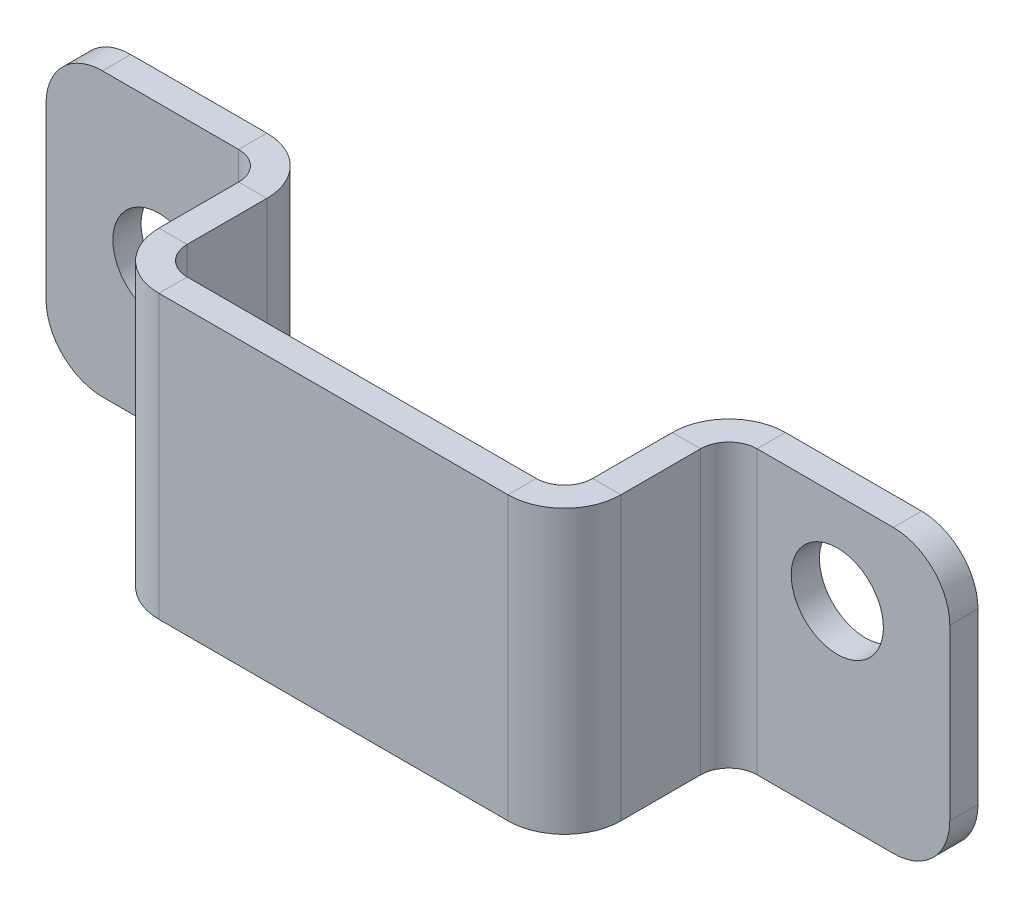
ISO-10303-21;
HEADER;
FILE_DESCRIPTION(('STEP AP214'),'2;1');
FILE_NAME('part.step','',(''),(''),'','','');
FILE_SCHEMA(('AUTOMOTIVE_DESIGN { 1 0 10303 214 1 1 1 1 }'));
ENDSEC;
DATA;
#1=APPLICATION_CONTEXT('core data for automotive mechanical design processes');
#2=APPLICATION_PROTOCOL_DEFINITION('international standard','automotive_design',2000,#1);
#3=PRODUCT_CONTEXT('',#1,'mechanical');
#4=PRODUCT('Part','Part','',(#3));
#5=PRODUCT_RELATED_PRODUCT_CATEGORY('part','',(#4));
#6=PRODUCT_DEFINITION_FORMATION('','',#4);
#7=PRODUCT_DEFINITION_CONTEXT('part definition',#1,'design');
#8=PRODUCT_DEFINITION('design','',#6,#7);
#9=PRODUCT_DEFINITION_SHAPE('','',#8);
#10=(LENGTH_UNIT() NAMED_UNIT(*) SI_UNIT(.MILLI.,.METRE.));
#11=(NAMED_UNIT(*) PLANE_ANGLE_UNIT() SI_UNIT($,.RADIAN.));
#12=(NAMED_UNIT(*) SI_UNIT($,.STERADIAN.) SOLID_ANGLE_UNIT());
#13=UNCERTAINTY_MEASURE_WITH_UNIT(LENGTH_MEASURE(1.E-05),#10,'distance_accuracy_value','');
#14=(GEOMETRIC_REPRESENTATION_CONTEXT(3) GLOBAL_UNCERTAINTY_ASSIGNED_CONTEXT((#13)) GLOBAL_UNIT_ASSIGNED_CONTEXT((#10,
#11,#12)) REPRESENTATION_CONTEXT('',''));
#15=CARTESIAN_POINT('',(0.,0.,0.));
#16=DIRECTION('',(0.,0.,1.));
#17=DIRECTION('',(1.,0.,0.));
#18=AXIS2_PLACEMENT_3D('',#15,#16,#17);
#19=CARTESIAN_POINT('',(18.535,3.,0.));
#20=DIRECTION('',(0.,0.,-1.));
#21=DIRECTION('',(-1.,0.,0.));
#22=AXIS2_PLACEMENT_3D('',#19,#20,#21);
#23=PLANE('',#22);
#24=DIRECTION('',(1.,0.,0.));
#25=VECTOR('',#24,1.);
#26=CARTESIAN_POINT('',(-18.535,-5.,0.));
#27=LINE('',#26,#25);
#28=CARTESIAN_POINT('',(-6.17880550980765,-5.,0.));
#29=VERTEX_POINT('',#28);
#30=CARTESIAN_POINT('',(6.17880550980766,-5.,0.));
#31=VERTEX_POINT('',#30);
#32=EDGE_CURVE('E72',#29,#31,#27,.T.);
#33=ORIENTED_EDGE('',*,*,#32,.T.);
#34=DIRECTION('',(0.,1.,0.));
#35=VECTOR('',#34,1.);
#36=CARTESIAN_POINT('',(6.17880550980766,3.,0.));
#37=LINE('',#36,#35);
#38=CARTESIAN_POINT('',(6.17880550980766,5.,0.));
#39=VERTEX_POINT('',#38);
#40=EDGE_CURVE('E64',#31,#39,#37,.T.);
#41=ORIENTED_EDGE('',*,*,#40,.T.);
#42=DIRECTION('',(-1.,0.,0.));
#43=VECTOR('',#42,1.);
#44=CARTESIAN_POINT('',(-18.535,5.,0.));
#45=LINE('',#44,#43);
#46=CARTESIAN_POINT('',(-6.17880550980765,5.,0.));
#47=VERTEX_POINT('',#46);
#48=EDGE_CURVE('E80',#39,#47,#45,.T.);
#49=ORIENTED_EDGE('',*,*,#48,.T.);
#50=DIRECTION('',(0.,1.,0.));
#51=VECTOR('',#50,1.);
#52=CARTESIAN_POINT('',(-6.17880550980765,3.,0.));
#53=LINE('',#52,#51);
#54=EDGE_CURVE('E440',#29,#47,#53,.T.);
#55=ORIENTED_EDGE('',*,*,#54,.F.);
#56=EDGE_LOOP('',(#33,#41,#49,#55));
#57=FACE_BOUND('',#56,.T.);
#58=ADVANCED_FACE('F55',(#57),#23,.F.);
#59=CARTESIAN_POINT('',(-18.535,-5.,-1.));
#60=DIRECTION('',(0.,-1.,0.));
#61=DIRECTION('',(0.,0.,-1.));
#62=AXIS2_PLACEMENT_3D('',#59,#60,#61);
#63=PLANE('',#62);
#64=DIRECTION('',(0.,0.,-1.));
#65=VECTOR('',#64,1.);
#66=CARTESIAN_POINT('',(6.17880550980766,-5.,-1.));
#67=LINE('',#66,#65);
#68=CARTESIAN_POINT('',(6.17880550980766,-5.,-1.));
#69=VERTEX_POINT('',#68);
#70=EDGE_CURVE('E12',#31,#69,#67,.T.);
#71=ORIENTED_EDGE('',*,*,#70,.F.);
#72=ORIENTED_EDGE('',*,*,#32,.F.);
#73=DIRECTION('',(0.,0.,-1.));
#74=VECTOR('',#73,1.);
#75=CARTESIAN_POINT('',(-6.17880550980765,-5.,-1.));
#76=LINE('',#75,#74);
#77=CARTESIAN_POINT('',(-6.17880550980765,-5.,-1.));
#78=VERTEX_POINT('',#77);
#79=EDGE_CURVE('E436',#29,#78,#76,.T.);
#80=ORIENTED_EDGE('',*,*,#79,.T.);
#81=DIRECTION('',(1.,0.,0.));
#82=VECTOR('',#81,1.);
#83=CARTESIAN_POINT('',(-18.535,-5.,-1.));
#84=LINE('',#83,#82);
#85=EDGE_CURVE('E437',#78,#69,#84,.T.);
#86=ORIENTED_EDGE('',*,*,#85,.T.);
#87=EDGE_LOOP('',(#71,#72,#80,#86));
#88=FACE_BOUND('',#87,.T.);
#89=ADVANCED_FACE('F57',(#88),#63,.T.);
#90=CARTESIAN_POINT('',(-18.535,5.,-1.));
#91=DIRECTION('',(0.,1.,0.));
#92=DIRECTION('',(0.,0.,1.));
#93=AXIS2_PLACEMENT_3D('',#90,#91,#92);
#94=PLANE('',#93);
#95=DIRECTION('',(0.,0.,1.));
#96=VECTOR('',#95,1.);
#97=CARTESIAN_POINT('',(6.17880550980766,5.,-1.));
#98=LINE('',#97,#96);
#99=CARTESIAN_POINT('',(6.17880550980766,5.,-1.));
#100=VERTEX_POINT('',#99);
#101=EDGE_CURVE('E448',#100,#39,#98,.T.);
#102=ORIENTED_EDGE('',*,*,#101,.F.);
#103=DIRECTION('',(-1.,0.,0.));
#104=VECTOR('',#103,1.);
#105=CARTESIAN_POINT('',(-18.535,5.,-1.));
#106=LINE('',#105,#104);
#107=CARTESIAN_POINT('',(-6.17880550980765,5.,-1.));
#108=VERTEX_POINT('',#107);
#109=EDGE_CURVE('E453',#100,#108,#106,.T.);
#110=ORIENTED_EDGE('',*,*,#109,.T.);
#111=DIRECTION('',(0.,0.,1.));
#112=VECTOR('',#111,1.);
#113=CARTESIAN_POINT('',(-6.17880550980765,5.,-1.));
#114=LINE('',#113,#112);
#115=EDGE_CURVE('E443',#108,#47,#114,.T.);
#116=ORIENTED_EDGE('',*,*,#115,.T.);
#117=ORIENTED_EDGE('',*,*,#48,.F.);
#118=EDGE_LOOP('',(#102,#110,#116,#117));
#119=FACE_BOUND('',#118,.T.);
#120=ADVANCED_FACE('F456',(#119),#94,.T.);
#121=CARTESIAN_POINT('',(18.535,3.,-1.));
#122=DIRECTION('',(0.,0.,-1.));
#123=DIRECTION('',(-1.,0.,0.));
#124=AXIS2_PLACEMENT_3D('',#121,#122,#123);
#125=PLANE('',#124);
#126=DIRECTION('',(0.,1.,0.));
#127=VECTOR('',#126,1.);
#128=CARTESIAN_POINT('',(6.17880550980766,3.,-1.));
#129=LINE('',#128,#127);
#130=EDGE_CURVE('E445',#69,#100,#129,.T.);
#131=ORIENTED_EDGE('',*,*,#130,.F.);
#132=ORIENTED_EDGE('',*,*,#85,.F.);
#133=DIRECTION('',(0.,1.,0.));
#134=VECTOR('',#133,1.);
#135=CARTESIAN_POINT('',(-6.17880550980765,3.,-1.));
#136=LINE('',#135,#134);
#137=EDGE_CURVE('E433',#78,#108,#136,.T.);
#138=ORIENTED_EDGE('',*,*,#137,.T.);
#139=ORIENTED_EDGE('',*,*,#109,.F.);
#140=EDGE_LOOP('',(#131,#132,#138,#139));
#141=FACE_BOUND('',#140,.T.);
#142=ADVANCED_FACE('F460',(#141),#125,.T.);
#143=CARTESIAN_POINT('',(-6.17880550980765,-5.,-2.));
#144=DIRECTION('',(0.,1.,0.));
#145=DIRECTION('',(0.,0.,1.));
#146=AXIS2_PLACEMENT_3D('',#143,#144,#145);
#147=PLANE('',#146);
#148=ORIENTED_EDGE('',*,*,#79,.F.);
#149=CARTESIAN_POINT('',(-6.17880550980765,-5.,-2.));
#150=DIRECTION('',(0.,1.,0.));
#151=DIRECTION('',(0.,0.,1.));
#152=AXIS2_PLACEMENT_3D('',#149,#150,#151);
#153=CIRCLE('',#152,2.);
#154=CARTESIAN_POINT('',(-8.17880550980765,-5.,-2.00000000000001));
#155=VERTEX_POINT('',#154);
#156=EDGE_CURVE('E333',#29,#155,#153,.F.);
#157=ORIENTED_EDGE('',*,*,#156,.T.);
#158=DIRECTION('',(1.,0.,0.));
#159=VECTOR('',#158,1.);
#160=CARTESIAN_POINT('',(-7.17880550980765,-5.,-2.));
#161=LINE('',#160,#159);
#162=CARTESIAN_POINT('',(-7.17880550980765,-5.,-2.));
#163=VERTEX_POINT('',#162);
#164=EDGE_CURVE('E415',#155,#163,#161,.T.);
#165=ORIENTED_EDGE('',*,*,#164,.T.);
#166=CARTESIAN_POINT('',(-6.17880550980765,-5.,-2.));
#167=DIRECTION('',(0.,-1.,0.));
#168=DIRECTION('',(0.,0.,1.));
#169=AXIS2_PLACEMENT_3D('',#166,#167,#168);
#170=CIRCLE('',#169,1.);
#171=EDGE_CURVE('E423',#78,#163,#170,.T.);
#172=ORIENTED_EDGE('',*,*,#171,.F.);
#173=EDGE_LOOP('',(#148,#157,#165,#172));
#174=FACE_BOUND('',#173,.T.);
#175=ADVANCED_FACE('F466',(#174),#147,.F.);
#176=CARTESIAN_POINT('',(-6.17880550980765,5.,-2.));
#177=DIRECTION('',(0.,-1.,0.));
#178=DIRECTION('',(0.,0.,-1.));
#179=AXIS2_PLACEMENT_3D('',#176,#177,#178);
#180=PLANE('',#179);
#181=CARTESIAN_POINT('',(-6.17880550980765,5.,-2.));
#182=DIRECTION('',(0.,1.,0.));
#183=DIRECTION('',(0.,0.,1.));
#184=AXIS2_PLACEMENT_3D('',#181,#182,#183);
#185=CIRCLE('',#184,2.);
#186=CARTESIAN_POINT('',(-8.17880550980765,5.,-2.00000000000001));
#187=VERTEX_POINT('',#186);
#188=EDGE_CURVE('E427',#187,#47,#185,.T.);
#189=ORIENTED_EDGE('',*,*,#188,.T.);
#190=ORIENTED_EDGE('',*,*,#115,.F.);
#191=CARTESIAN_POINT('',(-6.17880550980765,5.,-2.));
#192=DIRECTION('',(0.,1.,0.));
#193=DIRECTION('',(0.,0.,-1.));
#194=AXIS2_PLACEMENT_3D('',#191,#192,#193);
#195=CIRCLE('',#194,1.);
#196=CARTESIAN_POINT('',(-7.17880550980765,5.,-2.));
#197=VERTEX_POINT('',#196);
#198=EDGE_CURVE('E426',#197,#108,#195,.T.);
#199=ORIENTED_EDGE('',*,*,#198,.F.);
#200=DIRECTION('',(-1.,0.,0.));
#201=VECTOR('',#200,1.);
#202=CARTESIAN_POINT('',(-7.17880550980765,5.,-2.));
#203=LINE('',#202,#201);
#204=EDGE_CURVE('E418',#197,#187,#203,.T.);
#205=ORIENTED_EDGE('',*,*,#204,.T.);
#206=EDGE_LOOP('',(#189,#190,#199,#205));
#207=FACE_BOUND('',#206,.T.);
#208=ADVANCED_FACE('F481',(#207),#180,.F.);
#209=CARTESIAN_POINT('',(-6.17880550980765,-10.3223859875328,-2.));
#210=DIRECTION('',(0.,1.,0.));
#211=DIRECTION('',(0.,0.,1.));
#212=AXIS2_PLACEMENT_3D('',#209,#210,#211);
#213=CYLINDRICAL_SURFACE('',#212,1.);
#214=DIRECTION('',(0.,1.,0.));
#215=VECTOR('',#214,1.);
#216=CARTESIAN_POINT('',(-7.17880550980765,3.,-2.));
#217=LINE('',#216,#215);
#218=EDGE_CURVE('E325',#163,#197,#217,.T.);
#219=ORIENTED_EDGE('',*,*,#218,.T.);
#220=ORIENTED_EDGE('',*,*,#198,.T.);
#221=ORIENTED_EDGE('',*,*,#137,.F.);
#222=ORIENTED_EDGE('',*,*,#171,.T.);
#223=EDGE_LOOP('',(#219,#220,#221,#222));
#224=FACE_BOUND('',#223,.T.);
#225=ADVANCED_FACE('F463',(#224),#213,.F.);
#226=CARTESIAN_POINT('',(-6.17880550980765,-10.3223859875328,-2.));
#227=DIRECTION('',(0.,1.,0.));
#228=DIRECTION('',(0.,0.,1.));
#229=AXIS2_PLACEMENT_3D('',#226,#227,#228);
#230=CYLINDRICAL_SURFACE('',#229,2.);
#231=DIRECTION('',(0.,1.,0.));
#232=VECTOR('',#231,1.);
#233=CARTESIAN_POINT('',(-8.17880550980765,3.,-2.00000000000001));
#234=LINE('',#233,#232);
#235=EDGE_CURVE('E338',#155,#187,#234,.T.);
#236=ORIENTED_EDGE('',*,*,#235,.F.);
#237=ORIENTED_EDGE('',*,*,#156,.F.);
#238=ORIENTED_EDGE('',*,*,#54,.T.);
#239=ORIENTED_EDGE('',*,*,#188,.F.);
#240=EDGE_LOOP('',(#236,#237,#238,#239));
#241=FACE_BOUND('',#240,.T.);
#242=ADVANCED_FACE('F477',(#241),#230,.T.);
#243=CARTESIAN_POINT('',(-14.0007082647115,3.,-6.82190275490384));
#244=DIRECTION('',(0.,0.,1.));
#245=DIRECTION('',(1.,0.,0.));
#246=AXIS2_PLACEMENT_3D('',#243,#244,#245);
#247=CYLINDRICAL_SURFACE('',#246,2.);
#248=CARTESIAN_POINT('',(-14.0007082647115,3.,-5.82190275490384));
#249=DIRECTION('',(0.,0.,1.));
#250=DIRECTION('',(1.,0.,0.));
#251=AXIS2_PLACEMENT_3D('',#248,#249,#250);
#252=CIRCLE('',#251,2.);
#253=CARTESIAN_POINT('',(-14.0007082647115,5.,-5.82190275490384));
#254=VERTEX_POINT('',#253);
#255=CARTESIAN_POINT('',(-16.0007082647115,3.,-5.82190275490384));
#256=VERTEX_POINT('',#255);
#257=EDGE_CURVE('E385',#254,#256,#252,.T.);
#258=ORIENTED_EDGE('',*,*,#257,.F.);
#259=DIRECTION('',(0.,0.,1.));
#260=VECTOR('',#259,1.);
#261=CARTESIAN_POINT('',(-14.0007082647115,5.,-6.82190275490384));
#262=LINE('',#261,#260);
#263=CARTESIAN_POINT('',(-14.0007082647115,5.,-6.82190275490384));
#264=VERTEX_POINT('',#263);
#265=EDGE_CURVE('E395',#264,#254,#262,.T.);
#266=ORIENTED_EDGE('',*,*,#265,.F.);
#267=CARTESIAN_POINT('',(-14.0007082647115,3.,-6.82190275490384));
#268=DIRECTION('',(0.,0.,1.));
#269=DIRECTION('',(1.,0.,0.));
#270=AXIS2_PLACEMENT_3D('',#267,#268,#269);
#271=CIRCLE('',#270,2.);
#272=CARTESIAN_POINT('',(-16.0007082647115,3.,-6.82190275490384));
#273=VERTEX_POINT('',#272);
#274=EDGE_CURVE('E412',#264,#273,#271,.T.);
#275=ORIENTED_EDGE('',*,*,#274,.T.);
#276=DIRECTION('',(0.,0.,1.));
#277=VECTOR('',#276,1.);
#278=CARTESIAN_POINT('',(-16.0007082647115,3.,-6.82190275490384));
#279=LINE('',#278,#277);
#280=EDGE_CURVE('E410',#273,#256,#279,.T.);
#281=ORIENTED_EDGE('',*,*,#280,.T.);
#282=EDGE_LOOP('',(#258,#266,#275,#281));
#283=FACE_BOUND('',#282,.T.);
#284=ADVANCED_FACE('F519',(#283),#247,.T.);
#285=CARTESIAN_POINT('',(-16.0007082647115,3.,-6.82190275490384));
#286=DIRECTION('',(-1.,0.,0.));
#287=DIRECTION('',(0.,0.,1.));
#288=AXIS2_PLACEMENT_3D('',#285,#286,#287);
#289=PLANE('',#288);
#290=DIRECTION('',(0.,-1.,0.));
#291=VECTOR('',#290,1.);
#292=CARTESIAN_POINT('',(-16.0007082647115,3.,-5.82190275490384));
#293=LINE('',#292,#291);
#294=CARTESIAN_POINT('',(-16.0007082647115,-3.,-5.82190275490384));
#295=VERTEX_POINT('',#294);
#296=EDGE_CURVE('E382',#256,#295,#293,.T.);
#297=ORIENTED_EDGE('',*,*,#296,.F.);
#298=ORIENTED_EDGE('',*,*,#280,.F.);
#299=DIRECTION('',(0.,-1.,0.));
#300=VECTOR('',#299,1.);
#301=CARTESIAN_POINT('',(-16.0007082647115,3.,-6.82190275490384));
#302=LINE('',#301,#300);
#303=CARTESIAN_POINT('',(-16.0007082647115,-3.,-6.82190275490384));
#304=VERTEX_POINT('',#303);
#305=EDGE_CURVE('E407',#273,#304,#302,.T.);
#306=ORIENTED_EDGE('',*,*,#305,.T.);
#307=DIRECTION('',(0.,0.,1.));
#308=VECTOR('',#307,1.);
#309=CARTESIAN_POINT('',(-16.0007082647115,-3.,-6.82190275490384));
#310=LINE('',#309,#308);
#311=EDGE_CURVE('E405',#304,#295,#310,.T.);
#312=ORIENTED_EDGE('',*,*,#311,.T.);
#313=EDGE_LOOP('',(#297,#298,#306,#312));
#314=FACE_BOUND('',#313,.T.);
#315=ADVANCED_FACE('F523',(#314),#289,.T.);
#316=CARTESIAN_POINT('',(-14.0007082647115,-3.,-6.82190275490384));
#317=DIRECTION('',(0.,0.,1.));
#318=DIRECTION('',(1.,0.,0.));
#319=AXIS2_PLACEMENT_3D('',#316,#317,#318);
#320=CYLINDRICAL_SURFACE('',#319,2.);
#321=CARTESIAN_POINT('',(-14.0007082647115,-3.,-5.82190275490384));
#322=DIRECTION('',(0.,0.,1.));
#323=DIRECTION('',(1.,0.,0.));
#324=AXIS2_PLACEMENT_3D('',#321,#322,#323);
#325=CIRCLE('',#324,2.);
#326=CARTESIAN_POINT('',(-14.0007082647115,-5.,-5.82190275490384));
#327=VERTEX_POINT('',#326);
#328=EDGE_CURVE('E379',#295,#327,#325,.T.);
#329=ORIENTED_EDGE('',*,*,#328,.F.);
#330=ORIENTED_EDGE('',*,*,#311,.F.);
#331=CARTESIAN_POINT('',(-14.0007082647115,-3.,-6.82190275490384));
#332=DIRECTION('',(0.,0.,1.));
#333=DIRECTION('',(1.,0.,0.));
#334=AXIS2_PLACEMENT_3D('',#331,#332,#333);
#335=CIRCLE('',#334,2.);
#336=CARTESIAN_POINT('',(-14.0007082647115,-5.,-6.82190275490384));
#337=VERTEX_POINT('',#336);
#338=EDGE_CURVE('E402',#304,#337,#335,.T.);
#339=ORIENTED_EDGE('',*,*,#338,.T.);
#340=DIRECTION('',(0.,0.,1.));
#341=VECTOR('',#340,1.);
#342=CARTESIAN_POINT('',(-14.0007082647115,-5.,-6.82190275490384));
#343=LINE('',#342,#341);
#344=EDGE_CURVE('E400',#337,#327,#343,.T.);
#345=ORIENTED_EDGE('',*,*,#344,.T.);
#346=EDGE_LOOP('',(#329,#330,#339,#345));
#347=FACE_BOUND('',#346,.T.);
#348=ADVANCED_FACE('F525',(#347),#320,.T.);
#349=CARTESIAN_POINT('',(-14.0007082647115,5.,-6.82190275490384));
#350=DIRECTION('',(0.,1.,0.));
#351=DIRECTION('',(0.,0.,1.));
#352=AXIS2_PLACEMENT_3D('',#349,#350,#351);
#353=PLANE('',#352);
#354=DIRECTION('',(0.,0.,1.));
#355=VECTOR('',#354,1.);
#356=CARTESIAN_POINT('',(-9.17880550980763,5.,-6.82190275490384));
#357=LINE('',#356,#355);
#358=CARTESIAN_POINT('',(-9.17880550980764,5.,-6.82190275490384));
#359=VERTEX_POINT('',#358);
#360=CARTESIAN_POINT('',(-9.17880550980764,5.,-5.82190275490384));
#361=VERTEX_POINT('',#360);
#362=EDGE_CURVE('E370',#359,#361,#357,.T.);
#363=ORIENTED_EDGE('',*,*,#362,.F.);
#364=DIRECTION('',(-1.,0.,0.));
#365=VECTOR('',#364,1.);
#366=CARTESIAN_POINT('',(-14.0007082647115,5.,-6.82190275490384));
#367=LINE('',#366,#365);
#368=EDGE_CURVE('E398',#359,#264,#367,.T.);
#369=ORIENTED_EDGE('',*,*,#368,.T.);
#370=ORIENTED_EDGE('',*,*,#265,.T.);
#371=DIRECTION('',(-1.,0.,0.));
#372=VECTOR('',#371,1.);
#373=CARTESIAN_POINT('',(-14.0007082647115,5.,-5.82190275490384));
#374=LINE('',#373,#372);
#375=EDGE_CURVE('E388',#361,#254,#374,.T.);
#376=ORIENTED_EDGE('',*,*,#375,.F.);
#377=EDGE_LOOP('',(#363,#369,#370,#376));
#378=FACE_BOUND('',#377,.T.);
#379=ADVANCED_FACE('F510',(#378),#353,.T.);
#380=CARTESIAN_POINT('',(23.0692917352885,3.,-5.82190275490384));
#381=DIRECTION('',(0.,0.,-1.));
#382=DIRECTION('',(-1.,0.,0.));
#383=AXIS2_PLACEMENT_3D('',#380,#381,#382);
#384=PLANE('',#383);
#385=CARTESIAN_POINT('',(-12.0007082647115,0.,-5.82190275490384));
#386=DIRECTION('',(0.,0.,-1.));
#387=DIRECTION('',(-1.,0.,0.));
#388=AXIS2_PLACEMENT_3D('',#385,#386,#387);
#389=CIRCLE('',#388,1.63194999999999);
#390=CARTESIAN_POINT('',(-13.6326582647115,0.,-5.82190275490384));
#391=VERTEX_POINT('',#390);
#392=EDGE_CURVE('E580',#391,#391,#389,.T.);
#393=ORIENTED_EDGE('',*,*,#392,.T.);
#394=EDGE_LOOP('',(#393));
#395=FACE_BOUND('',#394,.T.);
#396=DIRECTION('',(1.,0.,0.));
#397=VECTOR('',#396,1.);
#398=CARTESIAN_POINT('',(-14.0007082647115,-5.,-5.82190275490384));
#399=LINE('',#398,#397);
#400=CARTESIAN_POINT('',(-9.17880550980764,-5.,-5.82190275490384));
#401=VERTEX_POINT('',#400);
#402=EDGE_CURVE('E393',#327,#401,#399,.T.);
#403=ORIENTED_EDGE('',*,*,#402,.T.);
#404=DIRECTION('',(0.,1.,0.));
#405=VECTOR('',#404,1.);
#406=CARTESIAN_POINT('',(-9.17880550980764,3.,-5.82190275490384));
#407=LINE('',#406,#405);
#408=EDGE_CURVE('E390',#401,#361,#407,.T.);
#409=ORIENTED_EDGE('',*,*,#408,.T.);
#410=ORIENTED_EDGE('',*,*,#375,.T.);
#411=ORIENTED_EDGE('',*,*,#257,.T.);
#412=ORIENTED_EDGE('',*,*,#296,.T.);
#413=ORIENTED_EDGE('',*,*,#328,.T.);
#414=EDGE_LOOP('',(#403,#409,#410,#411,#412,#413));
#415=FACE_BOUND('',#414,.T.);
#416=ADVANCED_FACE('F505',(#395,#415),#384,.F.);
#417=CARTESIAN_POINT('',(-14.0007082647115,-5.,-6.82190275490384));
#418=DIRECTION('',(0.,-1.,0.));
#419=DIRECTION('',(0.,0.,-1.));
#420=AXIS2_PLACEMENT_3D('',#417,#418,#419);
#421=PLANE('',#420);
#422=DIRECTION('',(0.,0.,-1.));
#423=VECTOR('',#422,1.);
#424=CARTESIAN_POINT('',(-9.17880550980763,-5.,-6.82190275490384));
#425=LINE('',#424,#423);
#426=CARTESIAN_POINT('',(-9.17880550980764,-5.,-6.82190275490384));
#427=VERTEX_POINT('',#426);
#428=EDGE_CURVE('E361',#401,#427,#425,.T.);
#429=ORIENTED_EDGE('',*,*,#428,.F.);
#430=ORIENTED_EDGE('',*,*,#402,.F.);
#431=ORIENTED_EDGE('',*,*,#344,.F.);
#432=DIRECTION('',(1.,0.,0.));
#433=VECTOR('',#432,1.);
#434=CARTESIAN_POINT('',(-14.0007082647115,-5.,-6.82190275490384));
#435=LINE('',#434,#433);
#436=EDGE_CURVE('E376',#337,#427,#435,.T.);
#437=ORIENTED_EDGE('',*,*,#436,.T.);
#438=EDGE_LOOP('',(#429,#430,#431,#437));
#439=FACE_BOUND('',#438,.T.);
#440=ADVANCED_FACE('F499',(#439),#421,.T.);
#441=CARTESIAN_POINT('',(23.0692917352885,3.,-6.82190275490384));
#442=DIRECTION('',(0.,0.,-1.));
#443=DIRECTION('',(-1.,0.,0.));
#444=AXIS2_PLACEMENT_3D('',#441,#442,#443);
#445=PLANE('',#444);
#446=CARTESIAN_POINT('',(-12.0007082647115,0.,-6.82190275490384));
#447=DIRECTION('',(0.,0.,1.));
#448=DIRECTION('',(1.,0.,0.));
#449=AXIS2_PLACEMENT_3D('',#446,#447,#448);
#450=CIRCLE('',#449,1.63195);
#451=CARTESIAN_POINT('',(-10.3687582647115,0.,-6.82190275490384));
#452=VERTEX_POINT('',#451);
#453=EDGE_CURVE('E583',#452,#452,#450,.T.);
#454=ORIENTED_EDGE('',*,*,#453,.T.);
#455=EDGE_LOOP('',(#454));
#456=FACE_BOUND('',#455,.T.);
#457=DIRECTION('',(0.,1.,0.));
#458=VECTOR('',#457,1.);
#459=CARTESIAN_POINT('',(-9.17880550980764,3.,-6.82190275490384));
#460=LINE('',#459,#458);
#461=EDGE_CURVE('E358',#427,#359,#460,.T.);
#462=ORIENTED_EDGE('',*,*,#461,.F.);
#463=ORIENTED_EDGE('',*,*,#436,.F.);
#464=ORIENTED_EDGE('',*,*,#338,.F.);
#465=ORIENTED_EDGE('',*,*,#305,.F.);
#466=ORIENTED_EDGE('',*,*,#274,.F.);
#467=ORIENTED_EDGE('',*,*,#368,.F.);
#468=EDGE_LOOP('',(#462,#463,#464,#465,#466,#467));
#469=FACE_BOUND('',#468,.T.);
#470=ADVANCED_FACE('F514',(#456,#469),#445,.T.);
#471=CARTESIAN_POINT('',(-9.17880550980764,5.,-4.82190275490384));
#472=DIRECTION('',(0.,1.,0.));
#473=DIRECTION('',(-1.,0.,0.));
#474=AXIS2_PLACEMENT_3D('',#471,#472,#473);
#475=PLANE('',#474);
#476=CARTESIAN_POINT('',(-9.17880550980764,5.,-4.82190275490384));
#477=DIRECTION('',(0.,1.,0.));
#478=DIRECTION('',(-1.,0.,0.));
#479=AXIS2_PLACEMENT_3D('',#476,#477,#478);
#480=CIRCLE('',#479,1.);
#481=CARTESIAN_POINT('',(-8.17880550980764,5.,-4.82190275490383));
#482=VERTEX_POINT('',#481);
#483=EDGE_CURVE('E373',#361,#482,#480,.F.);
#484=ORIENTED_EDGE('',*,*,#483,.T.);
#485=DIRECTION('',(-1.,0.,0.));
#486=VECTOR('',#485,1.);
#487=CARTESIAN_POINT('',(-7.17880550980764,5.,-4.82190275490383));
#488=LINE('',#487,#486);
#489=CARTESIAN_POINT('',(-7.17880550980764,5.,-4.82190275490383));
#490=VERTEX_POINT('',#489);
#491=EDGE_CURVE('E330',#490,#482,#488,.T.);
#492=ORIENTED_EDGE('',*,*,#491,.F.);
#493=CARTESIAN_POINT('',(-9.17880550980764,5.,-4.82190275490384));
#494=DIRECTION('',(0.,-1.,0.));
#495=DIRECTION('',(-1.,0.,0.));
#496=AXIS2_PLACEMENT_3D('',#493,#494,#495);
#497=CIRCLE('',#496,2.);
#498=EDGE_CURVE('E355',#359,#490,#497,.T.);
#499=ORIENTED_EDGE('',*,*,#498,.F.);
#500=ORIENTED_EDGE('',*,*,#362,.T.);
#501=EDGE_LOOP('',(#484,#492,#499,#500));
#502=FACE_BOUND('',#501,.T.);
#503=ADVANCED_FACE('F507',(#502),#475,.T.);
#504=CARTESIAN_POINT('',(-9.17880550980764,-10.3223859875328,-4.82190275490384));
#505=DIRECTION('',(0.,1.,0.));
#506=DIRECTION('',(-1.,0.,0.));
#507=AXIS2_PLACEMENT_3D('',#504,#505,#506);
#508=CYLINDRICAL_SURFACE('',#507,1.);
#509=ORIENTED_EDGE('',*,*,#408,.F.);
#510=CARTESIAN_POINT('',(-9.17880550980764,-5.,-4.82190275490384));
#511=DIRECTION('',(0.,1.,0.));
#512=DIRECTION('',(-1.,0.,0.));
#513=AXIS2_PLACEMENT_3D('',#510,#511,#512);
#514=CIRCLE('',#513,1.);
#515=CARTESIAN_POINT('',(-8.17880550980764,-5.,-4.82190275490383));
#516=VERTEX_POINT('',#515);
#517=EDGE_CURVE('E364',#516,#401,#514,.T.);
#518=ORIENTED_EDGE('',*,*,#517,.F.);
#519=DIRECTION('',(0.,1.,0.));
#520=VECTOR('',#519,1.);
#521=CARTESIAN_POINT('',(-8.17880550980764,3.,-4.82190275490383));
#522=LINE('',#521,#520);
#523=EDGE_CURVE('E367',#516,#482,#522,.T.);
#524=ORIENTED_EDGE('',*,*,#523,.T.);
#525=ORIENTED_EDGE('',*,*,#483,.F.);
#526=EDGE_LOOP('',(#509,#518,#524,#525));
#527=FACE_BOUND('',#526,.T.);
#528=ADVANCED_FACE('F503',(#527),#508,.F.);
#529=CARTESIAN_POINT('',(-9.17880550980764,-5.,-4.82190275490384));
#530=DIRECTION('',(0.,-1.,0.));
#531=DIRECTION('',(1.,0.,0.));
#532=AXIS2_PLACEMENT_3D('',#529,#530,#531);
#533=PLANE('',#532);
#534=DIRECTION('',(1.,0.,0.));
#535=VECTOR('',#534,1.);
#536=CARTESIAN_POINT('',(-7.17880550980764,-5.,-4.82190275490383));
#537=LINE('',#536,#535);
#538=CARTESIAN_POINT('',(-7.17880550980764,-5.,-4.82190275490383));
#539=VERTEX_POINT('',#538);
#540=EDGE_CURVE('E346',#516,#539,#537,.T.);
#541=ORIENTED_EDGE('',*,*,#540,.F.);
#542=ORIENTED_EDGE('',*,*,#517,.T.);
#543=ORIENTED_EDGE('',*,*,#428,.T.);
#544=CARTESIAN_POINT('',(-9.17880550980764,-5.,-4.82190275490384));
#545=DIRECTION('',(0.,1.,0.));
#546=DIRECTION('',(1.,0.,0.));
#547=AXIS2_PLACEMENT_3D('',#544,#545,#546);
#548=CIRCLE('',#547,2.);
#549=EDGE_CURVE('E352',#539,#427,#548,.T.);
#550=ORIENTED_EDGE('',*,*,#549,.F.);
#551=EDGE_LOOP('',(#541,#542,#543,#550));
#552=FACE_BOUND('',#551,.T.);
#553=ADVANCED_FACE('F493',(#552),#533,.T.);
#554=CARTESIAN_POINT('',(-9.17880550980764,-10.3223859875328,-4.82190275490384));
#555=DIRECTION('',(0.,1.,0.));
#556=DIRECTION('',(-1.,0.,0.));
#557=AXIS2_PLACEMENT_3D('',#554,#555,#556);
#558=CYLINDRICAL_SURFACE('',#557,2.);
#559=ORIENTED_EDGE('',*,*,#461,.T.);
#560=ORIENTED_EDGE('',*,*,#498,.T.);
#561=DIRECTION('',(0.,1.,0.));
#562=VECTOR('',#561,1.);
#563=CARTESIAN_POINT('',(-7.17880550980764,3.,-4.82190275490383));
#564=LINE('',#563,#562);
#565=EDGE_CURVE('E349',#539,#490,#564,.T.);
#566=ORIENTED_EDGE('',*,*,#565,.F.);
#567=ORIENTED_EDGE('',*,*,#549,.T.);
#568=EDGE_LOOP('',(#559,#560,#566,#567));
#569=FACE_BOUND('',#568,.T.);
#570=ADVANCED_FACE('F490',(#569),#558,.T.);
#571=CARTESIAN_POINT('',(-7.17880550980774,3.,25.07));
#572=DIRECTION('',(1.,0.,0.));
#573=DIRECTION('',(0.,0.,-1.));
#574=AXIS2_PLACEMENT_3D('',#571,#572,#573);
#575=PLANE('',#574);
#576=ORIENTED_EDGE('',*,*,#218,.F.);
#577=DIRECTION('',(0.,0.,1.));
#578=VECTOR('',#577,1.);
#579=CARTESIAN_POINT('',(-7.17880550980761,-5.,-12.));
#580=LINE('',#579,#578);
#581=EDGE_CURVE('E343',#539,#163,#580,.T.);
#582=ORIENTED_EDGE('',*,*,#581,.F.);
#583=ORIENTED_EDGE('',*,*,#565,.T.);
#584=DIRECTION('',(0.,0.,-1.));
#585=VECTOR('',#584,1.);
#586=CARTESIAN_POINT('',(-7.17880550980761,5.,-12.));
#587=LINE('',#586,#585);
#588=EDGE_CURVE('E334',#197,#490,#587,.T.);
#589=ORIENTED_EDGE('',*,*,#588,.F.);
#590=EDGE_LOOP('',(#576,#582,#583,#589));
#591=FACE_BOUND('',#590,.T.);
#592=ADVANCED_FACE('F487',(#591),#575,.T.);
#593=CARTESIAN_POINT('',(-7.17880550980761,-5.,-12.));
#594=DIRECTION('',(0.,-1.,0.));
#595=DIRECTION('',(1.,0.,0.));
#596=AXIS2_PLACEMENT_3D('',#593,#594,#595);
#597=PLANE('',#596);
#598=ORIENTED_EDGE('',*,*,#164,.F.);
#599=DIRECTION('',(0.,0.,1.));
#600=VECTOR('',#599,1.);
#601=CARTESIAN_POINT('',(-8.17880550980761,-5.,-12.));
#602=LINE('',#601,#600);
#603=EDGE_CURVE('E341',#516,#155,#602,.T.);
#604=ORIENTED_EDGE('',*,*,#603,.F.);
#605=ORIENTED_EDGE('',*,*,#540,.T.);
#606=ORIENTED_EDGE('',*,*,#581,.T.);
#607=EDGE_LOOP('',(#598,#604,#605,#606));
#608=FACE_BOUND('',#607,.T.);
#609=ADVANCED_FACE('F472',(#608),#597,.T.);
#610=CARTESIAN_POINT('',(-8.17880550980774,3.,25.07));
#611=DIRECTION('',(1.,0.,0.));
#612=DIRECTION('',(0.,0.,-1.));
#613=AXIS2_PLACEMENT_3D('',#610,#611,#612);
#614=PLANE('',#613);
#615=ORIENTED_EDGE('',*,*,#603,.T.);
#616=ORIENTED_EDGE('',*,*,#235,.T.);
#617=DIRECTION('',(0.,0.,-1.));
#618=VECTOR('',#617,1.);
#619=CARTESIAN_POINT('',(-8.17880550980761,5.,-12.));
#620=LINE('',#619,#618);
#621=EDGE_CURVE('E336',#187,#482,#620,.T.);
#622=ORIENTED_EDGE('',*,*,#621,.T.);
#623=ORIENTED_EDGE('',*,*,#523,.F.);
#624=EDGE_LOOP('',(#615,#616,#622,#623));
#625=FACE_BOUND('',#624,.T.);
#626=ADVANCED_FACE('F479',(#625),#614,.F.);
#627=CARTESIAN_POINT('',(-7.17880550980761,5.,-12.));
#628=DIRECTION('',(0.,1.,0.));
#629=DIRECTION('',(-1.,0.,0.));
#630=AXIS2_PLACEMENT_3D('',#627,#628,#629);
#631=PLANE('',#630);
#632=ORIENTED_EDGE('',*,*,#204,.F.);
#633=ORIENTED_EDGE('',*,*,#588,.T.);
#634=ORIENTED_EDGE('',*,*,#491,.T.);
#635=ORIENTED_EDGE('',*,*,#621,.F.);
#636=EDGE_LOOP('',(#632,#633,#634,#635));
#637=FACE_BOUND('',#636,.T.);
#638=ADVANCED_FACE('F484',(#637),#631,.T.);
#639=CARTESIAN_POINT('',(6.17880550980766,-5.,-2.));
#640=DIRECTION('',(0.,1.,0.));
#641=DIRECTION('',(0.,0.,1.));
#642=AXIS2_PLACEMENT_3D('',#639,#640,#641);
#643=PLANE('',#642);
#644=DIRECTION('',(-1.,0.,0.));
#645=VECTOR('',#644,1.);
#646=CARTESIAN_POINT('',(7.17880550980766,-5.,-2.));
#647=LINE('',#646,#645);
#648=CARTESIAN_POINT('',(8.17880550980766,-5.,-2.00000000000001));
#649=VERTEX_POINT('',#648);
#650=CARTESIAN_POINT('',(7.17880550980766,-5.,-2.));
#651=VERTEX_POINT('',#650);
#652=EDGE_CURVE('E228',#649,#651,#647,.T.);
#653=ORIENTED_EDGE('',*,*,#652,.F.);
#654=CARTESIAN_POINT('',(6.17880550980766,-5.,-2.));
#655=DIRECTION('',(0.,-1.,0.));
#656=DIRECTION('',(0.,0.,-1.));
#657=AXIS2_PLACEMENT_3D('',#654,#655,#656);
#658=CIRCLE('',#657,2.);
#659=EDGE_CURVE('E231',#649,#31,#658,.T.);
#660=ORIENTED_EDGE('',*,*,#659,.T.);
#661=ORIENTED_EDGE('',*,*,#70,.T.);
#662=CARTESIAN_POINT('',(6.17880550980766,-5.,-2.));
#663=DIRECTION('',(0.,-1.,0.));
#664=DIRECTION('',(0.,0.,1.));
#665=AXIS2_PLACEMENT_3D('',#662,#663,#664);
#666=CIRCLE('',#665,1.);
#667=EDGE_CURVE('E318',#651,#69,#666,.T.);
#668=ORIENTED_EDGE('',*,*,#667,.F.);
#669=EDGE_LOOP('',(#653,#660,#661,#668));
#670=FACE_BOUND('',#669,.T.);
#671=ADVANCED_FACE('F554',(#670),#643,.F.);
#672=CARTESIAN_POINT('',(6.17880550980766,5.,-2.));
#673=DIRECTION('',(0.,-1.,0.));
#674=DIRECTION('',(0.,0.,-1.));
#675=AXIS2_PLACEMENT_3D('',#672,#673,#674);
#676=PLANE('',#675);
#677=CARTESIAN_POINT('',(6.17880550980766,5.,-2.));
#678=DIRECTION('',(0.,-1.,0.));
#679=DIRECTION('',(0.,0.,-1.));
#680=AXIS2_PLACEMENT_3D('',#677,#678,#679);
#681=CIRCLE('',#680,2.);
#682=CARTESIAN_POINT('',(8.17880550980766,5.,-2.00000000000001));
#683=VERTEX_POINT('',#682);
#684=EDGE_CURVE('E322',#39,#683,#681,.F.);
#685=ORIENTED_EDGE('',*,*,#684,.T.);
#686=DIRECTION('',(1.,0.,0.));
#687=VECTOR('',#686,1.);
#688=CARTESIAN_POINT('',(7.17880550980766,5.,-2.));
#689=LINE('',#688,#687);
#690=CARTESIAN_POINT('',(7.17880550980766,5.,-2.));
#691=VERTEX_POINT('',#690);
#692=EDGE_CURVE('E598',#691,#683,#689,.T.);
#693=ORIENTED_EDGE('',*,*,#692,.F.);
#694=CARTESIAN_POINT('',(6.17880550980766,5.,-2.));
#695=DIRECTION('',(0.,1.,0.));
#696=DIRECTION('',(0.,0.,-1.));
#697=AXIS2_PLACEMENT_3D('',#694,#695,#696);
#698=CIRCLE('',#697,1.);
#699=EDGE_CURVE('E321',#100,#691,#698,.T.);
#700=ORIENTED_EDGE('',*,*,#699,.F.);
#701=ORIENTED_EDGE('',*,*,#101,.T.);
#702=EDGE_LOOP('',(#685,#693,#700,#701));
#703=FACE_BOUND('',#702,.T.);
#704=ADVANCED_FACE('F605',(#703),#676,.F.);
#705=CARTESIAN_POINT('',(6.17880550980766,10.3223859875328,-2.));
#706=DIRECTION('',(0.,-1.,0.));
#707=DIRECTION('',(0.,0.,-1.));
#708=AXIS2_PLACEMENT_3D('',#705,#706,#707);
#709=CYLINDRICAL_SURFACE('',#708,1.);
#710=ORIENTED_EDGE('',*,*,#130,.T.);
#711=ORIENTED_EDGE('',*,*,#699,.T.);
#712=DIRECTION('',(0.,1.,0.));
#713=VECTOR('',#712,1.);
#714=CARTESIAN_POINT('',(7.17880550980766,3.,-2.));
#715=LINE('',#714,#713);
#716=EDGE_CURVE('E259',#651,#691,#715,.T.);
#717=ORIENTED_EDGE('',*,*,#716,.F.);
#718=ORIENTED_EDGE('',*,*,#667,.T.);
#719=EDGE_LOOP('',(#710,#711,#717,#718));
#720=FACE_BOUND('',#719,.T.);
#721=ADVANCED_FACE('F608',(#720),#709,.F.);
#722=CARTESIAN_POINT('',(6.17880550980766,10.3223859875328,-2.));
#723=DIRECTION('',(0.,-1.,0.));
#724=DIRECTION('',(0.,0.,-1.));
#725=AXIS2_PLACEMENT_3D('',#722,#723,#724);
#726=CYLINDRICAL_SURFACE('',#725,2.);
#727=ORIENTED_EDGE('',*,*,#40,.F.);
#728=ORIENTED_EDGE('',*,*,#659,.F.);
#729=DIRECTION('',(0.,1.,0.));
#730=VECTOR('',#729,1.);
#731=CARTESIAN_POINT('',(8.17880550980766,3.,-2.00000000000001));
#732=LINE('',#731,#730);
#733=EDGE_CURVE('E315',#649,#683,#732,.T.);
#734=ORIENTED_EDGE('',*,*,#733,.T.);
#735=ORIENTED_EDGE('',*,*,#684,.F.);
#736=EDGE_LOOP('',(#727,#728,#734,#735));
#737=FACE_BOUND('',#736,.T.);
#738=ADVANCED_FACE('F614',(#737),#726,.T.);
#739=CARTESIAN_POINT('',(14.0007082647115,-3.,-6.82190275490384));
#740=DIRECTION('',(0.,0.,1.));
#741=DIRECTION('',(1.,0.,0.));
#742=AXIS2_PLACEMENT_3D('',#739,#740,#741);
#743=CYLINDRICAL_SURFACE('',#742,2.);
#744=CARTESIAN_POINT('',(14.0007082647115,-3.,-5.82190275490384));
#745=DIRECTION('',(0.,0.,1.));
#746=DIRECTION('',(1.,0.,0.));
#747=AXIS2_PLACEMENT_3D('',#744,#745,#746);
#748=CIRCLE('',#747,2.);
#749=CARTESIAN_POINT('',(14.0007082647115,-5.,-5.82190275490384));
#750=VERTEX_POINT('',#749);
#751=CARTESIAN_POINT('',(16.0007082647115,-3.,-5.82190275490384));
#752=VERTEX_POINT('',#751);
#753=EDGE_CURVE('E288',#750,#752,#748,.T.);
#754=ORIENTED_EDGE('',*,*,#753,.F.);
#755=DIRECTION('',(0.,0.,1.));
#756=VECTOR('',#755,1.);
#757=CARTESIAN_POINT('',(14.0007082647115,-5.,-6.82190275490384));
#758=LINE('',#757,#756);
#759=CARTESIAN_POINT('',(14.0007082647115,-5.,-6.82190275490384));
#760=VERTEX_POINT('',#759);
#761=EDGE_CURVE('E293',#760,#750,#758,.T.);
#762=ORIENTED_EDGE('',*,*,#761,.F.);
#763=CARTESIAN_POINT('',(14.0007082647115,-3.,-6.82190275490384));
#764=DIRECTION('',(0.,0.,1.));
#765=DIRECTION('',(1.,0.,0.));
#766=AXIS2_PLACEMENT_3D('',#763,#764,#765);
#767=CIRCLE('',#766,2.);
#768=CARTESIAN_POINT('',(16.0007082647115,-3.,-6.82190275490384));
#769=VERTEX_POINT('',#768);
#770=EDGE_CURVE('E312',#760,#769,#767,.T.);
#771=ORIENTED_EDGE('',*,*,#770,.T.);
#772=DIRECTION('',(0.,0.,1.));
#773=VECTOR('',#772,1.);
#774=CARTESIAN_POINT('',(16.0007082647115,-3.,-6.82190275490384));
#775=LINE('',#774,#773);
#776=EDGE_CURVE('E310',#769,#752,#775,.T.);
#777=ORIENTED_EDGE('',*,*,#776,.T.);
#778=EDGE_LOOP('',(#754,#762,#771,#777));
#779=FACE_BOUND('',#778,.T.);
#780=ADVANCED_FACE('F640',(#779),#743,.T.);
#781=CARTESIAN_POINT('',(16.0007082647115,3.,-6.82190275490384));
#782=DIRECTION('',(1.,0.,0.));
#783=DIRECTION('',(0.,0.,-1.));
#784=AXIS2_PLACEMENT_3D('',#781,#782,#783);
#785=PLANE('',#784);
#786=DIRECTION('',(0.,1.,0.));
#787=VECTOR('',#786,1.);
#788=CARTESIAN_POINT('',(16.0007082647115,3.,-5.82190275490384));
#789=LINE('',#788,#787);
#790=CARTESIAN_POINT('',(16.0007082647115,3.,-5.82190275490384));
#791=VERTEX_POINT('',#790);
#792=EDGE_CURVE('E285',#752,#791,#789,.T.);
#793=ORIENTED_EDGE('',*,*,#792,.F.);
#794=ORIENTED_EDGE('',*,*,#776,.F.);
#795=DIRECTION('',(0.,1.,0.));
#796=VECTOR('',#795,1.);
#797=CARTESIAN_POINT('',(16.0007082647115,3.,-6.82190275490384));
#798=LINE('',#797,#796);
#799=CARTESIAN_POINT('',(16.0007082647115,3.,-6.82190275490384));
#800=VERTEX_POINT('',#799);
#801=EDGE_CURVE('E307',#769,#800,#798,.T.);
#802=ORIENTED_EDGE('',*,*,#801,.T.);
#803=DIRECTION('',(0.,0.,1.));
#804=VECTOR('',#803,1.);
#805=CARTESIAN_POINT('',(16.0007082647115,3.,-6.82190275490384));
#806=LINE('',#805,#804);
#807=EDGE_CURVE('E305',#800,#791,#806,.T.);
#808=ORIENTED_EDGE('',*,*,#807,.T.);
#809=EDGE_LOOP('',(#793,#794,#802,#808));
#810=FACE_BOUND('',#809,.T.);
#811=ADVANCED_FACE('F643',(#810),#785,.T.);
#812=CARTESIAN_POINT('',(14.0007082647115,3.,-6.82190275490384));
#813=DIRECTION('',(0.,0.,1.));
#814=DIRECTION('',(1.,0.,0.));
#815=AXIS2_PLACEMENT_3D('',#812,#813,#814);
#816=CYLINDRICAL_SURFACE('',#815,2.);
#817=CARTESIAN_POINT('',(14.0007082647115,3.,-5.82190275490384));
#818=DIRECTION('',(0.,0.,1.));
#819=DIRECTION('',(-1.,0.,0.));
#820=AXIS2_PLACEMENT_3D('',#817,#818,#819);
#821=CIRCLE('',#820,2.);
#822=CARTESIAN_POINT('',(14.0007082647115,5.,-5.82190275490384));
#823=VERTEX_POINT('',#822);
#824=EDGE_CURVE('E282',#791,#823,#821,.T.);
#825=ORIENTED_EDGE('',*,*,#824,.F.);
#826=ORIENTED_EDGE('',*,*,#807,.F.);
#827=CARTESIAN_POINT('',(14.0007082647115,3.,-6.82190275490384));
#828=DIRECTION('',(0.,0.,1.));
#829=DIRECTION('',(-1.,0.,0.));
#830=AXIS2_PLACEMENT_3D('',#827,#828,#829);
#831=CIRCLE('',#830,2.);
#832=CARTESIAN_POINT('',(14.0007082647115,5.,-6.82190275490384));
#833=VERTEX_POINT('',#832);
#834=EDGE_CURVE('E302',#800,#833,#831,.T.);
#835=ORIENTED_EDGE('',*,*,#834,.T.);
#836=DIRECTION('',(0.,0.,1.));
#837=VECTOR('',#836,1.);
#838=CARTESIAN_POINT('',(14.0007082647115,5.,-6.82190275490384));
#839=LINE('',#838,#837);
#840=EDGE_CURVE('E300',#833,#823,#839,.T.);
#841=ORIENTED_EDGE('',*,*,#840,.T.);
#842=EDGE_LOOP('',(#825,#826,#835,#841));
#843=FACE_BOUND('',#842,.T.);
#844=ADVANCED_FACE('F646',(#843),#816,.T.);
#845=CARTESIAN_POINT('',(-23.0692917352885,-5.,-6.82190275490384));
#846=DIRECTION('',(0.,-1.,0.));
#847=DIRECTION('',(0.,0.,-1.));
#848=AXIS2_PLACEMENT_3D('',#845,#846,#847);
#849=PLANE('',#848);
#850=DIRECTION('',(1.,0.,0.));
#851=VECTOR('',#850,1.);
#852=CARTESIAN_POINT('',(-23.0692917352885,-5.,-5.82190275490384));
#853=LINE('',#852,#851);
#854=CARTESIAN_POINT('',(9.17880550980765,-5.,-5.82190275490384));
#855=VERTEX_POINT('',#854);
#856=EDGE_CURVE('E291',#855,#750,#853,.T.);
#857=ORIENTED_EDGE('',*,*,#856,.F.);
#858=DIRECTION('',(0.,0.,-1.));
#859=VECTOR('',#858,1.);
#860=CARTESIAN_POINT('',(9.17880550980765,-5.,-6.82190275490384));
#861=LINE('',#860,#859);
#862=CARTESIAN_POINT('',(9.17880550980765,-5.,-6.82190275490384));
#863=VERTEX_POINT('',#862);
#864=EDGE_CURVE('E298',#855,#863,#861,.T.);
#865=ORIENTED_EDGE('',*,*,#864,.T.);
#866=DIRECTION('',(1.,0.,0.));
#867=VECTOR('',#866,1.);
#868=CARTESIAN_POINT('',(-23.0692917352885,-5.,-6.82190275490384));
#869=LINE('',#868,#867);
#870=EDGE_CURVE('E296',#863,#760,#869,.T.);
#871=ORIENTED_EDGE('',*,*,#870,.T.);
#872=ORIENTED_EDGE('',*,*,#761,.T.);
#873=EDGE_LOOP('',(#857,#865,#871,#872));
#874=FACE_BOUND('',#873,.T.);
#875=ADVANCED_FACE('F630',(#874),#849,.T.);
#876=CARTESIAN_POINT('',(14.0007082647115,3.,-5.82190275490384));
#877=DIRECTION('',(0.,0.,-1.));
#878=DIRECTION('',(-1.,0.,0.));
#879=AXIS2_PLACEMENT_3D('',#876,#877,#878);
#880=PLANE('',#879);
#881=CARTESIAN_POINT('',(12.0189627010397,1.74797216713422,-5.82190275490384));
#882=DIRECTION('',(0.,0.,-1.));
#883=DIRECTION('',(-1.,0.,0.));
#884=AXIS2_PLACEMENT_3D('',#881,#882,#883);
#885=CIRCLE('',#884,1.63194999999999);
#886=CARTESIAN_POINT('',(10.3870127010397,1.74797216713422,-5.82190275490384));
#887=VERTEX_POINT('',#886);
#888=EDGE_CURVE('E59',#887,#887,#885,.T.);
#889=ORIENTED_EDGE('',*,*,#888,.T.);
#890=EDGE_LOOP('',(#889));
#891=FACE_BOUND('',#890,.T.);
#892=DIRECTION('',(0.,1.,0.));
#893=VECTOR('',#892,1.);
#894=CARTESIAN_POINT('',(9.17880550980765,3.,-5.82190275490384));
#895=LINE('',#894,#893);
#896=CARTESIAN_POINT('',(9.17880550980765,5.,-5.82190275490384));
#897=VERTEX_POINT('',#896);
#898=EDGE_CURVE('E254',#855,#897,#895,.T.);
#899=ORIENTED_EDGE('',*,*,#898,.F.);
#900=ORIENTED_EDGE('',*,*,#856,.T.);
#901=ORIENTED_EDGE('',*,*,#753,.T.);
#902=ORIENTED_EDGE('',*,*,#792,.T.);
#903=ORIENTED_EDGE('',*,*,#824,.T.);
#904=DIRECTION('',(-1.,0.,0.));
#905=VECTOR('',#904,1.);
#906=CARTESIAN_POINT('',(-23.0692917352885,5.,-5.82190275490384));
#907=LINE('',#906,#905);
#908=EDGE_CURVE('E280',#823,#897,#907,.T.);
#909=ORIENTED_EDGE('',*,*,#908,.T.);
#910=EDGE_LOOP('',(#899,#900,#901,#902,#903,#909));
#911=FACE_BOUND('',#910,.T.);
#912=ADVANCED_FACE('F626',(#891,#911),#880,.F.);
#913=CARTESIAN_POINT('',(-23.0692917352885,5.,-6.82190275490384));
#914=DIRECTION('',(0.,1.,0.));
#915=DIRECTION('',(0.,0.,1.));
#916=AXIS2_PLACEMENT_3D('',#913,#914,#915);
#917=PLANE('',#916);
#918=DIRECTION('',(-1.,0.,0.));
#919=VECTOR('',#918,1.);
#920=CARTESIAN_POINT('',(-23.0692917352885,5.,-6.82190275490384));
#921=LINE('',#920,#919);
#922=CARTESIAN_POINT('',(9.17880550980765,5.,-6.82190275490384));
#923=VERTEX_POINT('',#922);
#924=EDGE_CURVE('E277',#833,#923,#921,.T.);
#925=ORIENTED_EDGE('',*,*,#924,.T.);
#926=DIRECTION('',(0.,0.,1.));
#927=VECTOR('',#926,1.);
#928=CARTESIAN_POINT('',(9.17880550980765,5.,-6.82190275490384));
#929=LINE('',#928,#927);
#930=EDGE_CURVE('E274',#923,#897,#929,.T.);
#931=ORIENTED_EDGE('',*,*,#930,.T.);
#932=ORIENTED_EDGE('',*,*,#908,.F.);
#933=ORIENTED_EDGE('',*,*,#840,.F.);
#934=EDGE_LOOP('',(#925,#931,#932,#933));
#935=FACE_BOUND('',#934,.T.);
#936=ADVANCED_FACE('F648',(#935),#917,.T.);
#937=CARTESIAN_POINT('',(14.0007082647115,3.,-6.82190275490384));
#938=DIRECTION('',(0.,0.,-1.));
#939=DIRECTION('',(-1.,0.,0.));
#940=AXIS2_PLACEMENT_3D('',#937,#938,#939);
#941=PLANE('',#940);
#942=CARTESIAN_POINT('',(12.0189627010397,1.74797216713422,-6.82190275490384));
#943=DIRECTION('',(0.,0.,1.));
#944=DIRECTION('',(1.,0.,0.));
#945=AXIS2_PLACEMENT_3D('',#942,#943,#944);
#946=CIRCLE('',#945,1.63195);
#947=CARTESIAN_POINT('',(13.6509127010397,1.74797216713422,-6.82190275490384));
#948=VERTEX_POINT('',#947);
#949=EDGE_CURVE('E582',#948,#948,#946,.T.);
#950=ORIENTED_EDGE('',*,*,#949,.T.);
#951=EDGE_LOOP('',(#950));
#952=FACE_BOUND('',#951,.T.);
#953=ORIENTED_EDGE('',*,*,#870,.F.);
#954=DIRECTION('',(0.,1.,0.));
#955=VECTOR('',#954,1.);
#956=CARTESIAN_POINT('',(9.17880550980765,3.,-6.82190275490384));
#957=LINE('',#956,#955);
#958=EDGE_CURVE('E258',#863,#923,#957,.T.);
#959=ORIENTED_EDGE('',*,*,#958,.T.);
#960=ORIENTED_EDGE('',*,*,#924,.F.);
#961=ORIENTED_EDGE('',*,*,#834,.F.);
#962=ORIENTED_EDGE('',*,*,#801,.F.);
#963=ORIENTED_EDGE('',*,*,#770,.F.);
#964=EDGE_LOOP('',(#953,#959,#960,#961,#962,#963));
#965=FACE_BOUND('',#964,.T.);
#966=ADVANCED_FACE('F634',(#952,#965),#941,.T.);
#967=CARTESIAN_POINT('',(9.17880550980765,-5.,-4.82190275490384));
#968=DIRECTION('',(0.,-1.,0.));
#969=DIRECTION('',(-1.,0.,0.));
#970=AXIS2_PLACEMENT_3D('',#967,#968,#969);
#971=PLANE('',#970);
#972=ORIENTED_EDGE('',*,*,#864,.F.);
#973=CARTESIAN_POINT('',(9.17880550980765,-5.,-4.82190275490384));
#974=DIRECTION('',(0.,-1.,0.));
#975=DIRECTION('',(-1.,0.,0.));
#976=AXIS2_PLACEMENT_3D('',#973,#974,#975);
#977=CIRCLE('',#976,1.);
#978=CARTESIAN_POINT('',(8.17880550980765,-5.,-4.82190275490383));
#979=VERTEX_POINT('',#978);
#980=EDGE_CURVE('E253',#855,#979,#977,.F.);
#981=ORIENTED_EDGE('',*,*,#980,.T.);
#982=DIRECTION('',(-1.,0.,0.));
#983=VECTOR('',#982,1.);
#984=CARTESIAN_POINT('',(7.17880550980765,-5.,-4.82190275490383));
#985=LINE('',#984,#983);
#986=CARTESIAN_POINT('',(7.17880550980765,-5.,-4.82190275490383));
#987=VERTEX_POINT('',#986);
#988=EDGE_CURVE('E225',#979,#987,#985,.T.);
#989=ORIENTED_EDGE('',*,*,#988,.T.);
#990=CARTESIAN_POINT('',(9.17880550980765,-5.,-4.82190275490384));
#991=DIRECTION('',(0.,1.,0.));
#992=DIRECTION('',(-1.,0.,0.));
#993=AXIS2_PLACEMENT_3D('',#990,#991,#992);
#994=CIRCLE('',#993,2.);
#995=EDGE_CURVE('E251',#863,#987,#994,.T.);
#996=ORIENTED_EDGE('',*,*,#995,.F.);
#997=EDGE_LOOP('',(#972,#981,#989,#996));
#998=FACE_BOUND('',#997,.T.);
#999=ADVANCED_FACE('F250',(#998),#971,.T.);
#1000=CARTESIAN_POINT('',(9.17880550980765,10.3223859875328,-4.82190275490384));
#1001=DIRECTION('',(0.,-1.,0.));
#1002=DIRECTION('',(-1.,0.,0.));
#1003=AXIS2_PLACEMENT_3D('',#1000,#1001,#1002);
#1004=CYLINDRICAL_SURFACE('',#1003,1.);
#1005=DIRECTION('',(0.,1.,0.));
#1006=VECTOR('',#1005,1.);
#1007=CARTESIAN_POINT('',(8.17880550980765,3.,-4.82190275490383));
#1008=LINE('',#1007,#1006);
#1009=CARTESIAN_POINT('',(8.17880550980765,5.,-4.82190275490383));
#1010=VERTEX_POINT('',#1009);
#1011=EDGE_CURVE('E593',#979,#1010,#1008,.T.);
#1012=ORIENTED_EDGE('',*,*,#1011,.F.);
#1013=ORIENTED_EDGE('',*,*,#980,.F.);
#1014=ORIENTED_EDGE('',*,*,#898,.T.);
#1015=CARTESIAN_POINT('',(9.17880550980765,5.,-4.82190275490384));
#1016=DIRECTION('',(0.,-1.,0.));
#1017=DIRECTION('',(-1.,0.,0.));
#1018=AXIS2_PLACEMENT_3D('',#1015,#1016,#1017);
#1019=CIRCLE('',#1018,1.);
#1020=EDGE_CURVE('E267',#1010,#897,#1019,.T.);
#1021=ORIENTED_EDGE('',*,*,#1020,.F.);
#1022=EDGE_LOOP('',(#1012,#1013,#1014,#1021));
#1023=FACE_BOUND('',#1022,.T.);
#1024=ADVANCED_FACE('F623',(#1023),#1004,.F.);
#1025=CARTESIAN_POINT('',(9.17880550980765,5.,-4.82190275490384));
#1026=DIRECTION('',(0.,1.,0.));
#1027=DIRECTION('',(1.,0.,0.));
#1028=AXIS2_PLACEMENT_3D('',#1025,#1026,#1027);
#1029=PLANE('',#1028);
#1030=ORIENTED_EDGE('',*,*,#1020,.T.);
#1031=ORIENTED_EDGE('',*,*,#930,.F.);
#1032=CARTESIAN_POINT('',(9.17880550980765,5.,-4.82190275490384));
#1033=DIRECTION('',(0.,-1.,0.));
#1034=DIRECTION('',(1.,0.,0.));
#1035=AXIS2_PLACEMENT_3D('',#1032,#1033,#1034);
#1036=CIRCLE('',#1035,2.);
#1037=CARTESIAN_POINT('',(7.17880550980765,5.,-4.82190275490383));
#1038=VERTEX_POINT('',#1037);
#1039=EDGE_CURVE('E243',#1038,#923,#1036,.T.);
#1040=ORIENTED_EDGE('',*,*,#1039,.F.);
#1041=DIRECTION('',(1.,0.,0.));
#1042=VECTOR('',#1041,1.);
#1043=CARTESIAN_POINT('',(7.17880550980765,5.,-4.82190275490383));
#1044=LINE('',#1043,#1042);
#1045=EDGE_CURVE('E244',#1038,#1010,#1044,.T.);
#1046=ORIENTED_EDGE('',*,*,#1045,.T.);
#1047=EDGE_LOOP('',(#1030,#1031,#1040,#1046));
#1048=FACE_BOUND('',#1047,.T.);
#1049=ADVANCED_FACE('F621',(#1048),#1029,.T.);
#1050=CARTESIAN_POINT('',(9.17880550980765,10.3223859875328,-4.82190275490384));
#1051=DIRECTION('',(0.,-1.,0.));
#1052=DIRECTION('',(-1.,0.,0.));
#1053=AXIS2_PLACEMENT_3D('',#1050,#1051,#1052);
#1054=CYLINDRICAL_SURFACE('',#1053,2.);
#1055=DIRECTION('',(0.,1.,0.));
#1056=VECTOR('',#1055,1.);
#1057=CARTESIAN_POINT('',(7.17880550980765,3.,-4.82190275490383));
#1058=LINE('',#1057,#1056);
#1059=EDGE_CURVE('E234',#987,#1038,#1058,.T.);
#1060=ORIENTED_EDGE('',*,*,#1059,.T.);
#1061=ORIENTED_EDGE('',*,*,#1039,.T.);
#1062=ORIENTED_EDGE('',*,*,#958,.F.);
#1063=ORIENTED_EDGE('',*,*,#995,.T.);
#1064=EDGE_LOOP('',(#1060,#1061,#1062,#1063));
#1065=FACE_BOUND('',#1064,.T.);
#1066=ADVANCED_FACE('F257',(#1065),#1054,.T.);
#1067=CARTESIAN_POINT('',(7.17880550980762,3.,-12.));
#1068=DIRECTION('',(-1.,0.,0.));
#1069=DIRECTION('',(0.,0.,1.));
#1070=AXIS2_PLACEMENT_3D('',#1067,#1068,#1069);
#1071=PLANE('',#1070);
#1072=DIRECTION('',(0.,0.,-1.));
#1073=VECTOR('',#1072,1.);
#1074=CARTESIAN_POINT('',(7.17880550980775,-5.,25.07));
#1075=LINE('',#1074,#1073);
#1076=EDGE_CURVE('E221',#651,#987,#1075,.T.);
#1077=ORIENTED_EDGE('',*,*,#1076,.F.);
#1078=ORIENTED_EDGE('',*,*,#716,.T.);
#1079=DIRECTION('',(0.,0.,1.));
#1080=VECTOR('',#1079,1.);
#1081=CARTESIAN_POINT('',(7.17880550980775,5.,25.07));
#1082=LINE('',#1081,#1080);
#1083=EDGE_CURVE('E237',#1038,#691,#1082,.T.);
#1084=ORIENTED_EDGE('',*,*,#1083,.F.);
#1085=ORIENTED_EDGE('',*,*,#1059,.F.);
#1086=EDGE_LOOP('',(#1077,#1078,#1084,#1085));
#1087=FACE_BOUND('',#1086,.T.);
#1088=ADVANCED_FACE('F235',(#1087),#1071,.T.);
#1089=CARTESIAN_POINT('',(7.17880550980775,5.,25.07));
#1090=DIRECTION('',(0.,1.,0.));
#1091=DIRECTION('',(1.,0.,0.));
#1092=AXIS2_PLACEMENT_3D('',#1089,#1090,#1091);
#1093=PLANE('',#1092);
#1094=ORIENTED_EDGE('',*,*,#1083,.T.);
#1095=ORIENTED_EDGE('',*,*,#692,.T.);
#1096=DIRECTION('',(0.,0.,1.));
#1097=VECTOR('',#1096,1.);
#1098=CARTESIAN_POINT('',(8.17880550980775,5.,25.07));
#1099=LINE('',#1098,#1097);
#1100=EDGE_CURVE('E591',#1010,#683,#1099,.T.);
#1101=ORIENTED_EDGE('',*,*,#1100,.F.);
#1102=ORIENTED_EDGE('',*,*,#1045,.F.);
#1103=EDGE_LOOP('',(#1094,#1095,#1101,#1102));
#1104=FACE_BOUND('',#1103,.T.);
#1105=ADVANCED_FACE('F602',(#1104),#1093,.T.);
#1106=CARTESIAN_POINT('',(8.17880550980762,3.,-12.));
#1107=DIRECTION('',(-1.,0.,0.));
#1108=DIRECTION('',(0.,0.,1.));
#1109=AXIS2_PLACEMENT_3D('',#1106,#1107,#1108);
#1110=PLANE('',#1109);
#1111=ORIENTED_EDGE('',*,*,#733,.F.);
#1112=DIRECTION('',(0.,0.,-1.));
#1113=VECTOR('',#1112,1.);
#1114=CARTESIAN_POINT('',(8.17880550980775,-5.,25.07));
#1115=LINE('',#1114,#1113);
#1116=EDGE_CURVE('E596',#649,#979,#1115,.T.);
#1117=ORIENTED_EDGE('',*,*,#1116,.T.);
#1118=ORIENTED_EDGE('',*,*,#1011,.T.);
#1119=ORIENTED_EDGE('',*,*,#1100,.T.);
#1120=EDGE_LOOP('',(#1111,#1117,#1118,#1119));
#1121=FACE_BOUND('',#1120,.T.);
#1122=ADVANCED_FACE('F617',(#1121),#1110,.F.);
#1123=CARTESIAN_POINT('',(7.17880550980775,-5.,25.07));
#1124=DIRECTION('',(0.,-1.,0.));
#1125=DIRECTION('',(-1.,0.,0.));
#1126=AXIS2_PLACEMENT_3D('',#1123,#1124,#1125);
#1127=PLANE('',#1126);
#1128=ORIENTED_EDGE('',*,*,#1116,.F.);
#1129=ORIENTED_EDGE('',*,*,#652,.T.);
#1130=ORIENTED_EDGE('',*,*,#1076,.T.);
#1131=ORIENTED_EDGE('',*,*,#988,.F.);
#1132=EDGE_LOOP('',(#1128,#1129,#1130,#1131));
#1133=FACE_BOUND('',#1132,.T.);
#1134=ADVANCED_FACE('F223',(#1133),#1127,.T.);
#1135=CARTESIAN_POINT('',(12.0189627010397,1.74797216713422,0.));
#1136=DIRECTION('',(0.,0.,1.));
#1137=DIRECTION('',(1.,0.,0.));
#1138=AXIS2_PLACEMENT_3D('',#1135,#1136,#1137);
#1139=CYLINDRICAL_SURFACE('',#1138,1.63194999999999);
#1140=ORIENTED_EDGE('',*,*,#949,.F.);
#1141=EDGE_LOOP('',(#1140));
#1142=FACE_BOUND('',#1141,.T.);
#1143=ORIENTED_EDGE('',*,*,#888,.F.);
#1144=EDGE_LOOP('',(#1143));
#1145=FACE_BOUND('',#1144,.T.);
#1146=ADVANCED_FACE('F677',(#1142,#1145),#1139,.F.);
#1147=CARTESIAN_POINT('',(-12.0007082647115,0.,0.));
#1148=DIRECTION('',(0.,0.,1.));
#1149=DIRECTION('',(1.,0.,0.));
#1150=AXIS2_PLACEMENT_3D('',#1147,#1148,#1149);
#1151=CYLINDRICAL_SURFACE('',#1150,1.63194999999999);
#1152=ORIENTED_EDGE('',*,*,#453,.F.);
#1153=EDGE_LOOP('',(#1152));
#1154=FACE_BOUND('',#1153,.T.);
#1155=ORIENTED_EDGE('',*,*,#392,.F.);
#1156=EDGE_LOOP('',(#1155));
#1157=FACE_BOUND('',#1156,.T.);
#1158=ADVANCED_FACE('F932',(#1154,#1157),#1151,.F.);
#1159=CLOSED_SHELL('',(#58,#89,#120,#142,#175,#208,#225,#242,#284,#315,#348,#379,#416,#440,#470,
#503,#528,#553,#570,#592,#609,#626,#638,#671,#704,#721,#738,#780,#811,#844,#875,#912,#936,#966,
#999,#1024,#1049,#1066,#1088,#1105,#1122,#1134,#1146,#1158));
#1160=MANIFOLD_SOLID_BREP('B2',#1159);
#1161=ADVANCED_BREP_SHAPE_REPRESENTATION('',(#18,#1160),#14);
#1162=SHAPE_DEFINITION_REPRESENTATION(#9,#1161);
ENDSEC;
END-ISO-10303-21;
